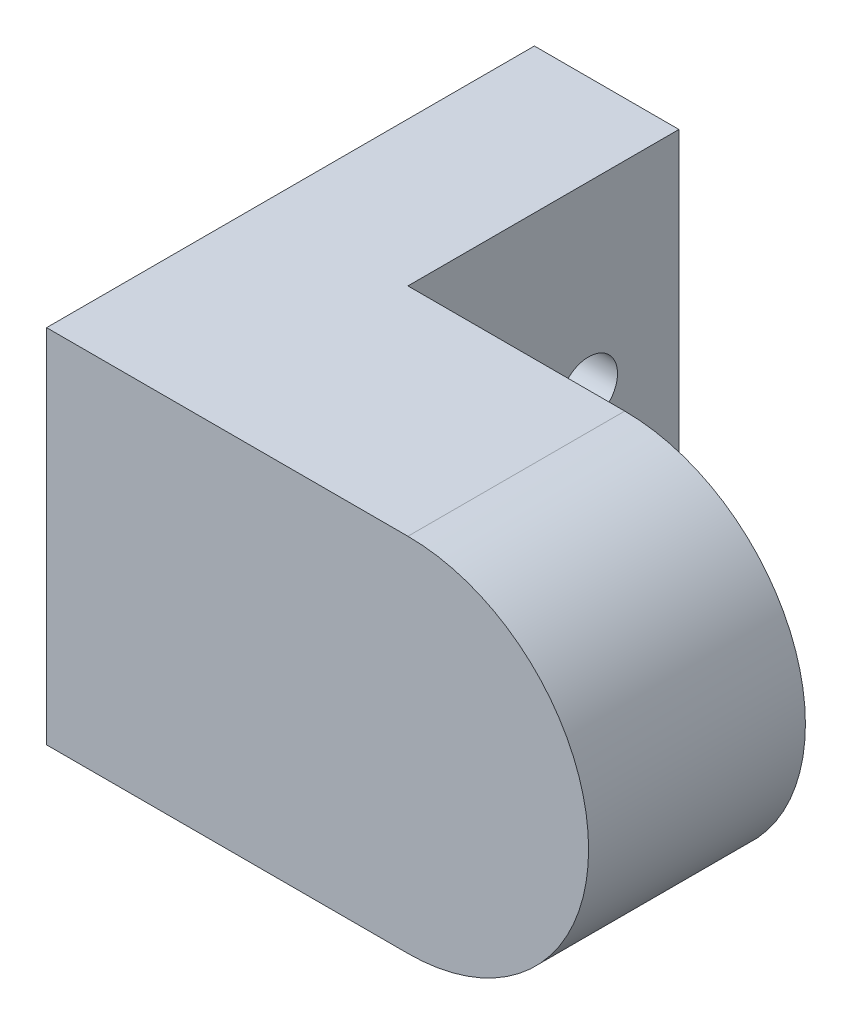
ISO-10303-21;
HEADER;
FILE_DESCRIPTION(('STEP AP214'),'2;1');
FILE_NAME('part.step','',(''),(''),'','','');
FILE_SCHEMA(('AUTOMOTIVE_DESIGN { 1 0 10303 214 1 1 1 1 }'));
ENDSEC;
DATA;
#1=APPLICATION_CONTEXT('core data for automotive mechanical design processes');
#2=APPLICATION_PROTOCOL_DEFINITION('international standard','automotive_design',2000,#1);
#3=PRODUCT_CONTEXT('',#1,'mechanical');
#4=PRODUCT('Part','Part','',(#3));
#5=PRODUCT_RELATED_PRODUCT_CATEGORY('part','',(#4));
#6=PRODUCT_DEFINITION_FORMATION('','',#4);
#7=PRODUCT_DEFINITION_CONTEXT('part definition',#1,'design');
#8=PRODUCT_DEFINITION('design','',#6,#7);
#9=PRODUCT_DEFINITION_SHAPE('','',#8);
#10=(LENGTH_UNIT() NAMED_UNIT(*) SI_UNIT(.MILLI.,.METRE.));
#11=(NAMED_UNIT(*) PLANE_ANGLE_UNIT() SI_UNIT($,.RADIAN.));
#12=(NAMED_UNIT(*) SI_UNIT($,.STERADIAN.) SOLID_ANGLE_UNIT());
#13=UNCERTAINTY_MEASURE_WITH_UNIT(LENGTH_MEASURE(1.E-05),#10,'distance_accuracy_value','');
#14=(GEOMETRIC_REPRESENTATION_CONTEXT(3) GLOBAL_UNCERTAINTY_ASSIGNED_CONTEXT((#13)) GLOBAL_UNIT_ASSIGNED_CONTEXT((#10,
#11,#12)) REPRESENTATION_CONTEXT('',''));
#15=CARTESIAN_POINT('',(0.,0.,0.));
#16=DIRECTION('',(0.,0.,1.));
#17=DIRECTION('',(1.,0.,0.));
#18=AXIS2_PLACEMENT_3D('',#15,#16,#17);
#19=CARTESIAN_POINT('',(0.,0.,0.));
#20=DIRECTION('',(0.,0.,1.));
#21=DIRECTION('',(1.,0.,0.));
#22=AXIS2_PLACEMENT_3D('',#19,#20,#21);
#23=PLANE('',#22);
#24=DIRECTION('',(-1.,0.,0.));
#25=VECTOR('',#24,1.);
#26=CARTESIAN_POINT('',(0.,10.,0.));
#27=LINE('',#26,#25);
#28=CARTESIAN_POINT('',(-12.,10.,0.));
#29=VERTEX_POINT('',#28);
#30=CARTESIAN_POINT('',(-20.,10.,0.));
#31=VERTEX_POINT('',#30);
#32=EDGE_CURVE('E135',#29,#31,#27,.T.);
#33=ORIENTED_EDGE('',*,*,#32,.F.);
#34=DIRECTION('',(0.,1.,0.));
#35=VECTOR('',#34,1.);
#36=CARTESIAN_POINT('',(-12.,-10.,0.));
#37=LINE('',#36,#35);
#38=CARTESIAN_POINT('',(-12.,-10.,0.));
#39=VERTEX_POINT('',#38);
#40=EDGE_CURVE('E125',#39,#29,#37,.T.);
#41=ORIENTED_EDGE('',*,*,#40,.F.);
#42=DIRECTION('',(1.,0.,0.));
#43=VECTOR('',#42,1.);
#44=CARTESIAN_POINT('',(-20.,-10.,0.));
#45=LINE('',#44,#43);
#46=CARTESIAN_POINT('',(-20.,-10.,0.));
#47=VERTEX_POINT('',#46);
#48=EDGE_CURVE('E138',#47,#39,#45,.T.);
#49=ORIENTED_EDGE('',*,*,#48,.F.);
#50=DIRECTION('',(0.,-1.,0.));
#51=VECTOR('',#50,1.);
#52=CARTESIAN_POINT('',(-20.,10.,0.));
#53=LINE('',#52,#51);
#54=EDGE_CURVE('E57',#31,#47,#53,.T.);
#55=ORIENTED_EDGE('',*,*,#54,.F.);
#56=EDGE_LOOP('',(#33,#41,#49,#55));
#57=FACE_BOUND('',#56,.T.);
#58=ADVANCED_FACE('F33',(#57),#23,.F.);
#59=CARTESIAN_POINT('',(0.,0.,25.));
#60=DIRECTION('',(0.,0.,-1.));
#61=DIRECTION('',(-1.,0.,0.));
#62=AXIS2_PLACEMENT_3D('',#59,#60,#61);
#63=CYLINDRICAL_SURFACE('',#62,10.);
#64=CARTESIAN_POINT('',(0.,0.,15.));
#65=DIRECTION('',(0.,0.,1.));
#66=DIRECTION('',(1.,0.,0.));
#67=AXIS2_PLACEMENT_3D('',#64,#65,#66);
#68=CIRCLE('',#67,10.);
#69=CARTESIAN_POINT('',(0.,-10.,15.));
#70=VERTEX_POINT('',#69);
#71=CARTESIAN_POINT('',(0.,10.,15.));
#72=VERTEX_POINT('',#71);
#73=EDGE_CURVE('E92',#70,#72,#68,.T.);
#74=ORIENTED_EDGE('',*,*,#73,.T.);
#75=DIRECTION('',(0.,0.,-1.));
#76=VECTOR('',#75,1.);
#77=CARTESIAN_POINT('',(0.,10.,25.));
#78=LINE('',#77,#76);
#79=CARTESIAN_POINT('',(0.,10.,27.));
#80=VERTEX_POINT('',#79);
#81=EDGE_CURVE('E11',#80,#72,#78,.T.);
#82=ORIENTED_EDGE('',*,*,#81,.F.);
#83=CARTESIAN_POINT('',(0.,0.,27.));
#84=DIRECTION('',(0.,0.,1.));
#85=DIRECTION('',(1.,0.,0.));
#86=AXIS2_PLACEMENT_3D('',#83,#84,#85);
#87=CIRCLE('',#86,10.);
#88=CARTESIAN_POINT('',(0.,-10.,27.));
#89=VERTEX_POINT('',#88);
#90=EDGE_CURVE('E91',#89,#80,#87,.T.);
#91=ORIENTED_EDGE('',*,*,#90,.F.);
#92=DIRECTION('',(0.,0.,-1.));
#93=VECTOR('',#92,1.);
#94=CARTESIAN_POINT('',(0.,-10.,25.));
#95=LINE('',#94,#93);
#96=EDGE_CURVE('E141',#89,#70,#95,.T.);
#97=ORIENTED_EDGE('',*,*,#96,.T.);
#98=EDGE_LOOP('',(#74,#82,#91,#97));
#99=FACE_BOUND('',#98,.T.);
#100=ADVANCED_FACE('F35',(#99),#63,.T.);
#101=CARTESIAN_POINT('',(0.,10.,25.));
#102=DIRECTION('',(0.,-1.,0.));
#103=DIRECTION('',(0.,0.,-1.));
#104=AXIS2_PLACEMENT_3D('',#101,#102,#103);
#105=PLANE('',#104);
#106=ORIENTED_EDGE('',*,*,#81,.T.);
#107=DIRECTION('',(-1.,0.,0.));
#108=VECTOR('',#107,1.);
#109=CARTESIAN_POINT('',(0.,10.,15.));
#110=LINE('',#109,#108);
#111=CARTESIAN_POINT('',(-12.,10.,15.));
#112=VERTEX_POINT('',#111);
#113=EDGE_CURVE('E129',#72,#112,#110,.T.);
#114=ORIENTED_EDGE('',*,*,#113,.T.);
#115=DIRECTION('',(0.,0.,-1.));
#116=VECTOR('',#115,1.);
#117=CARTESIAN_POINT('',(-12.,10.,25.));
#118=LINE('',#117,#116);
#119=EDGE_CURVE('E132',#112,#29,#118,.T.);
#120=ORIENTED_EDGE('',*,*,#119,.T.);
#121=ORIENTED_EDGE('',*,*,#32,.T.);
#122=DIRECTION('',(0.,0.,-1.));
#123=VECTOR('',#122,1.);
#124=CARTESIAN_POINT('',(-20.,10.,25.));
#125=LINE('',#124,#123);
#126=CARTESIAN_POINT('',(-20.,10.,27.));
#127=VERTEX_POINT('',#126);
#128=EDGE_CURVE('E42',#127,#31,#125,.T.);
#129=ORIENTED_EDGE('',*,*,#128,.F.);
#130=DIRECTION('',(-1.,0.,0.));
#131=VECTOR('',#130,1.);
#132=CARTESIAN_POINT('',(0.,10.,27.));
#133=LINE('',#132,#131);
#134=EDGE_CURVE('E97',#80,#127,#133,.T.);
#135=ORIENTED_EDGE('',*,*,#134,.F.);
#136=EDGE_LOOP('',(#106,#114,#120,#121,#129,#135));
#137=FACE_BOUND('',#136,.T.);
#138=ADVANCED_FACE('F98',(#137),#105,.F.);
#139=CARTESIAN_POINT('',(-20.,10.,25.));
#140=DIRECTION('',(1.,0.,0.));
#141=DIRECTION('',(0.,0.,-1.));
#142=AXIS2_PLACEMENT_3D('',#139,#140,#141);
#143=PLANE('',#142);
#144=CARTESIAN_POINT('',(-20.,0.,5.));
#145=DIRECTION('',(1.,0.,0.));
#146=DIRECTION('',(0.,0.,-1.));
#147=AXIS2_PLACEMENT_3D('',#144,#145,#146);
#148=CIRCLE('',#147,1.6);
#149=CARTESIAN_POINT('',(-20.,0.,3.4));
#150=VERTEX_POINT('',#149);
#151=EDGE_CURVE('E118',#150,#150,#148,.T.);
#152=ORIENTED_EDGE('',*,*,#151,.T.);
#153=EDGE_LOOP('',(#152));
#154=FACE_BOUND('',#153,.T.);
#155=ORIENTED_EDGE('',*,*,#54,.T.);
#156=DIRECTION('',(0.,0.,-1.));
#157=VECTOR('',#156,1.);
#158=CARTESIAN_POINT('',(-20.,-10.,25.));
#159=LINE('',#158,#157);
#160=CARTESIAN_POINT('',(-20.,-10.,27.));
#161=VERTEX_POINT('',#160);
#162=EDGE_CURVE('E143',#161,#47,#159,.T.);
#163=ORIENTED_EDGE('',*,*,#162,.F.);
#164=DIRECTION('',(0.,-1.,0.));
#165=VECTOR('',#164,1.);
#166=CARTESIAN_POINT('',(-20.,10.,27.));
#167=LINE('',#166,#165);
#168=EDGE_CURVE('E102',#127,#161,#167,.T.);
#169=ORIENTED_EDGE('',*,*,#168,.F.);
#170=ORIENTED_EDGE('',*,*,#128,.T.);
#171=EDGE_LOOP('',(#155,#163,#169,#170));
#172=FACE_BOUND('',#171,.T.);
#173=ADVANCED_FACE('F145',(#154,#172),#143,.F.);
#174=CARTESIAN_POINT('',(-20.,-10.,25.));
#175=DIRECTION('',(0.,1.,0.));
#176=DIRECTION('',(0.,0.,1.));
#177=AXIS2_PLACEMENT_3D('',#174,#175,#176);
#178=PLANE('',#177);
#179=DIRECTION('',(0.,0.,1.));
#180=VECTOR('',#179,1.);
#181=CARTESIAN_POINT('',(-12.,-10.,0.));
#182=LINE('',#181,#180);
#183=CARTESIAN_POINT('',(-12.,-10.,15.));
#184=VERTEX_POINT('',#183);
#185=EDGE_CURVE('E121',#39,#184,#182,.T.);
#186=ORIENTED_EDGE('',*,*,#185,.T.);
#187=DIRECTION('',(1.,0.,0.));
#188=VECTOR('',#187,1.);
#189=CARTESIAN_POINT('',(-12.,-10.,15.));
#190=LINE('',#189,#188);
#191=EDGE_CURVE('E49',#184,#70,#190,.T.);
#192=ORIENTED_EDGE('',*,*,#191,.T.);
#193=ORIENTED_EDGE('',*,*,#96,.F.);
#194=DIRECTION('',(1.,0.,0.));
#195=VECTOR('',#194,1.);
#196=CARTESIAN_POINT('',(-20.,-10.,27.));
#197=LINE('',#196,#195);
#198=EDGE_CURVE('E107',#161,#89,#197,.T.);
#199=ORIENTED_EDGE('',*,*,#198,.F.);
#200=ORIENTED_EDGE('',*,*,#162,.T.);
#201=ORIENTED_EDGE('',*,*,#48,.T.);
#202=EDGE_LOOP('',(#186,#192,#193,#199,#200,#201));
#203=FACE_BOUND('',#202,.T.);
#204=ADVANCED_FACE('F151',(#203),#178,.F.);
#205=CARTESIAN_POINT('',(0.,0.,25.));
#206=DIRECTION('',(0.,0.,-1.));
#207=DIRECTION('',(-1.,0.,0.));
#208=AXIS2_PLACEMENT_3D('',#205,#206,#207);
#209=CYLINDRICAL_SURFACE('',#208,4.);
#210=CARTESIAN_POINT('',(0.,0.,15.));
#211=DIRECTION('',(0.,0.,1.));
#212=DIRECTION('',(1.,0.,0.));
#213=AXIS2_PLACEMENT_3D('',#210,#211,#212);
#214=CIRCLE('',#213,4.);
#215=CARTESIAN_POINT('',(4.,0.,15.));
#216=VERTEX_POINT('',#215);
#217=EDGE_CURVE('E37',#216,#216,#214,.T.);
#218=ORIENTED_EDGE('',*,*,#217,.F.);
#219=EDGE_LOOP('',(#218));
#220=FACE_BOUND('',#219,.T.);
#221=CARTESIAN_POINT('',(0.,0.,25.));
#222=DIRECTION('',(0.,0.,1.));
#223=DIRECTION('',(1.,0.,0.));
#224=AXIS2_PLACEMENT_3D('',#221,#222,#223);
#225=CIRCLE('',#224,4.);
#226=CARTESIAN_POINT('',(4.,0.,25.));
#227=VERTEX_POINT('',#226);
#228=EDGE_CURVE('E112',#227,#227,#225,.T.);
#229=ORIENTED_EDGE('',*,*,#228,.T.);
#230=EDGE_LOOP('',(#229));
#231=FACE_BOUND('',#230,.T.);
#232=ADVANCED_FACE('F166',(#220,#231),#209,.F.);
#233=CARTESIAN_POINT('',(-12.,-10.,0.));
#234=DIRECTION('',(-1.,0.,0.));
#235=DIRECTION('',(0.,0.,1.));
#236=AXIS2_PLACEMENT_3D('',#233,#234,#235);
#237=PLANE('',#236);
#238=CARTESIAN_POINT('',(-12.,0.,5.));
#239=DIRECTION('',(1.,0.,0.));
#240=DIRECTION('',(0.,0.,-1.));
#241=AXIS2_PLACEMENT_3D('',#238,#239,#240);
#242=CIRCLE('',#241,1.6);
#243=CARTESIAN_POINT('',(-12.,0.,3.4));
#244=VERTEX_POINT('',#243);
#245=EDGE_CURVE('E115',#244,#244,#242,.T.);
#246=ORIENTED_EDGE('',*,*,#245,.F.);
#247=EDGE_LOOP('',(#246));
#248=FACE_BOUND('',#247,.T.);
#249=DIRECTION('',(0.,1.,0.));
#250=VECTOR('',#249,1.);
#251=CARTESIAN_POINT('',(-12.,-10.,15.));
#252=LINE('',#251,#250);
#253=EDGE_CURVE('E126',#184,#112,#252,.T.);
#254=ORIENTED_EDGE('',*,*,#253,.F.);
#255=ORIENTED_EDGE('',*,*,#185,.F.);
#256=ORIENTED_EDGE('',*,*,#40,.T.);
#257=ORIENTED_EDGE('',*,*,#119,.F.);
#258=EDGE_LOOP('',(#254,#255,#256,#257));
#259=FACE_BOUND('',#258,.T.);
#260=ADVANCED_FACE('F153',(#248,#259),#237,.F.);
#261=CARTESIAN_POINT('',(-12.,-10.,15.));
#262=DIRECTION('',(0.,0.,1.));
#263=DIRECTION('',(1.,0.,0.));
#264=AXIS2_PLACEMENT_3D('',#261,#262,#263);
#265=PLANE('',#264);
#266=ORIENTED_EDGE('',*,*,#217,.T.);
#267=EDGE_LOOP('',(#266));
#268=FACE_BOUND('',#267,.T.);
#269=ORIENTED_EDGE('',*,*,#191,.F.);
#270=ORIENTED_EDGE('',*,*,#253,.T.);
#271=ORIENTED_EDGE('',*,*,#113,.F.);
#272=ORIENTED_EDGE('',*,*,#73,.F.);
#273=EDGE_LOOP('',(#269,#270,#271,#272));
#274=FACE_BOUND('',#273,.T.);
#275=ADVANCED_FACE('F154',(#268,#274),#265,.F.);
#276=CARTESIAN_POINT('',(-32.,0.,5.));
#277=DIRECTION('',(1.,0.,0.));
#278=DIRECTION('',(0.,0.,-1.));
#279=AXIS2_PLACEMENT_3D('',#276,#277,#278);
#280=CYLINDRICAL_SURFACE('',#279,1.6);
#281=ORIENTED_EDGE('',*,*,#245,.T.);
#282=EDGE_LOOP('',(#281));
#283=FACE_BOUND('',#282,.T.);
#284=ORIENTED_EDGE('',*,*,#151,.F.);
#285=EDGE_LOOP('',(#284));
#286=FACE_BOUND('',#285,.T.);
#287=ADVANCED_FACE('F156',(#283,#286),#280,.F.);
#288=CARTESIAN_POINT('',(0.,0.,25.));
#289=DIRECTION('',(0.,0.,1.));
#290=DIRECTION('',(1.,0.,0.));
#291=AXIS2_PLACEMENT_3D('',#288,#289,#290);
#292=PLANE('',#291);
#293=ORIENTED_EDGE('',*,*,#228,.F.);
#294=EDGE_LOOP('',(#293));
#295=FACE_BOUND('',#294,.T.);
#296=ADVANCED_FACE('F163',(#295),#292,.F.);
#297=CARTESIAN_POINT('',(0.,0.,27.));
#298=DIRECTION('',(0.,0.,1.));
#299=DIRECTION('',(1.,0.,0.));
#300=AXIS2_PLACEMENT_3D('',#297,#298,#299);
#301=PLANE('',#300);
#302=ORIENTED_EDGE('',*,*,#90,.T.);
#303=ORIENTED_EDGE('',*,*,#134,.T.);
#304=ORIENTED_EDGE('',*,*,#168,.T.);
#305=ORIENTED_EDGE('',*,*,#198,.T.);
#306=EDGE_LOOP('',(#302,#303,#304,#305));
#307=FACE_BOUND('',#306,.T.);
#308=ADVANCED_FACE('F105',(#307),#301,.T.);
#309=CLOSED_SHELL('',(#58,#100,#138,#173,#204,#232,#260,#275,#287,#296,#308));
#310=MANIFOLD_SOLID_BREP('B2',#309);
#311=ADVANCED_BREP_SHAPE_REPRESENTATION('',(#18,#310),#14);
#312=SHAPE_DEFINITION_REPRESENTATION(#9,#311);
ENDSEC;
END-ISO-10303-21;
